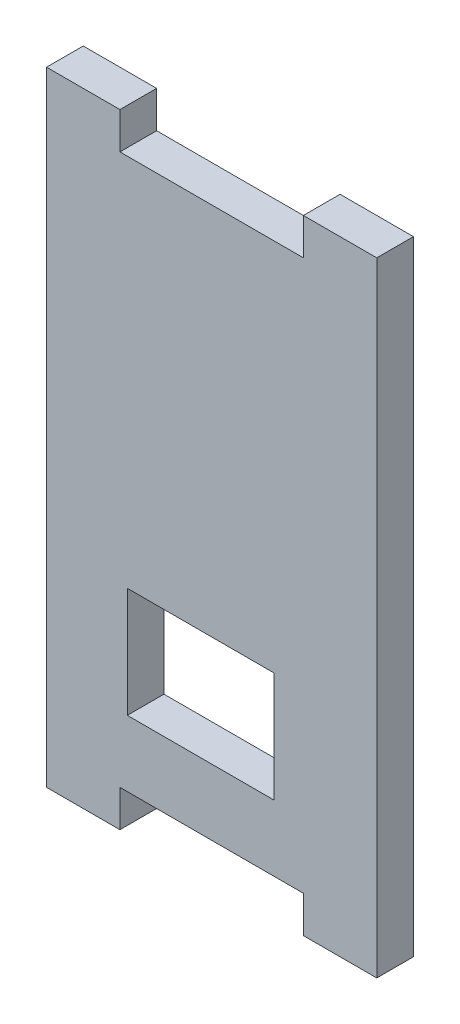
ISO-10303-21;
HEADER;
FILE_DESCRIPTION(('STEP AP214'),'2;1');
FILE_NAME('part.step','',(''),(''),'','','');
FILE_SCHEMA(('AUTOMOTIVE_DESIGN { 1 0 10303 214 1 1 1 1 }'));
ENDSEC;
DATA;
#1=APPLICATION_CONTEXT('core data for automotive mechanical design processes');
#2=APPLICATION_PROTOCOL_DEFINITION('international standard','automotive_design',2000,#1);
#3=PRODUCT_CONTEXT('',#1,'mechanical');
#4=PRODUCT('Part','Part','',(#3));
#5=PRODUCT_RELATED_PRODUCT_CATEGORY('part','',(#4));
#6=PRODUCT_DEFINITION_FORMATION('','',#4);
#7=PRODUCT_DEFINITION_CONTEXT('part definition',#1,'design');
#8=PRODUCT_DEFINITION('design','',#6,#7);
#9=PRODUCT_DEFINITION_SHAPE('','',#8);
#10=(LENGTH_UNIT() NAMED_UNIT(*) SI_UNIT(.MILLI.,.METRE.));
#11=(NAMED_UNIT(*) PLANE_ANGLE_UNIT() SI_UNIT($,.RADIAN.));
#12=(NAMED_UNIT(*) SI_UNIT($,.STERADIAN.) SOLID_ANGLE_UNIT());
#13=UNCERTAINTY_MEASURE_WITH_UNIT(LENGTH_MEASURE(1.E-05),#10,'distance_accuracy_value','');
#14=(GEOMETRIC_REPRESENTATION_CONTEXT(3) GLOBAL_UNCERTAINTY_ASSIGNED_CONTEXT((#13)) GLOBAL_UNIT_ASSIGNED_CONTEXT((#10,
#11,#12)) REPRESENTATION_CONTEXT('',''));
#15=CARTESIAN_POINT('',(0.,0.,0.));
#16=DIRECTION('',(0.,0.,1.));
#17=DIRECTION('',(1.,0.,0.));
#18=AXIS2_PLACEMENT_3D('',#15,#16,#17);
#19=CARTESIAN_POINT('',(0.,0.,5.));
#20=DIRECTION('',(0.,1.,0.));
#21=DIRECTION('',(0.,0.,1.));
#22=AXIS2_PLACEMENT_3D('',#19,#20,#21);
#23=PLANE('',#22);
#24=DIRECTION('',(1.,0.,0.));
#25=VECTOR('',#24,1.);
#26=CARTESIAN_POINT('',(0.,0.,0.));
#27=LINE('',#26,#25);
#28=CARTESIAN_POINT('',(9.99999999999999,0.,0.));
#29=VERTEX_POINT('',#28);
#30=CARTESIAN_POINT('',(35.,0.,0.));
#31=VERTEX_POINT('',#30);
#32=EDGE_CURVE('E164',#29,#31,#27,.T.);
#33=ORIENTED_EDGE('',*,*,#32,.T.);
#34=DIRECTION('',(0.,0.,1.));
#35=VECTOR('',#34,1.);
#36=CARTESIAN_POINT('',(35.,0.,0.));
#37=LINE('',#36,#35);
#38=CARTESIAN_POINT('',(35.,0.,5.));
#39=VERTEX_POINT('',#38);
#40=EDGE_CURVE('E149',#31,#39,#37,.T.);
#41=ORIENTED_EDGE('',*,*,#40,.T.);
#42=DIRECTION('',(1.,0.,0.));
#43=VECTOR('',#42,1.);
#44=CARTESIAN_POINT('',(0.,0.,5.));
#45=LINE('',#44,#43);
#46=CARTESIAN_POINT('',(10.,0.,5.));
#47=VERTEX_POINT('',#46);
#48=EDGE_CURVE('E180',#47,#39,#45,.T.);
#49=ORIENTED_EDGE('',*,*,#48,.F.);
#50=DIRECTION('',(0.,0.,1.));
#51=VECTOR('',#50,1.);
#52=CARTESIAN_POINT('',(10.,0.,0.));
#53=LINE('',#52,#51);
#54=EDGE_CURVE('E50',#29,#47,#53,.T.);
#55=ORIENTED_EDGE('',*,*,#54,.F.);
#56=EDGE_LOOP('',(#33,#41,#49,#55));
#57=FACE_BOUND('',#56,.T.);
#58=ADVANCED_FACE('F33',(#57),#23,.F.);
#59=CARTESIAN_POINT('',(0.,0.,5.));
#60=DIRECTION('',(0.,0.,-1.));
#61=DIRECTION('',(-1.,0.,0.));
#62=AXIS2_PLACEMENT_3D('',#59,#60,#61);
#63=PLANE('',#62);
#64=DIRECTION('',(0.,-1.,0.));
#65=VECTOR('',#64,1.);
#66=CARTESIAN_POINT('',(0.,0.,5.));
#67=LINE('',#66,#65);
#68=CARTESIAN_POINT('',(0.,80.,5.));
#69=VERTEX_POINT('',#68);
#70=CARTESIAN_POINT('',(0.,-5.00000000000002,5.));
#71=VERTEX_POINT('',#70);
#72=EDGE_CURVE('E190',#69,#71,#67,.T.);
#73=ORIENTED_EDGE('',*,*,#72,.T.);
#74=DIRECTION('',(1.,0.,0.));
#75=VECTOR('',#74,1.);
#76=CARTESIAN_POINT('',(0.,-5.00000000000002,5.));
#77=LINE('',#76,#75);
#78=CARTESIAN_POINT('',(10.,-5.00000000000002,5.));
#79=VERTEX_POINT('',#78);
#80=EDGE_CURVE('E263',#71,#79,#77,.T.);
#81=ORIENTED_EDGE('',*,*,#80,.T.);
#82=DIRECTION('',(0.,1.,0.));
#83=VECTOR('',#82,1.);
#84=CARTESIAN_POINT('',(10.,0.,5.));
#85=LINE('',#84,#83);
#86=EDGE_CURVE('E249',#79,#47,#85,.T.);
#87=ORIENTED_EDGE('',*,*,#86,.T.);
#88=ORIENTED_EDGE('',*,*,#48,.T.);
#89=DIRECTION('',(0.,-1.,0.));
#90=VECTOR('',#89,1.);
#91=CARTESIAN_POINT('',(35.,0.,5.));
#92=LINE('',#91,#90);
#93=CARTESIAN_POINT('',(35.,-5.,5.));
#94=VERTEX_POINT('',#93);
#95=EDGE_CURVE('E155',#39,#94,#92,.T.);
#96=ORIENTED_EDGE('',*,*,#95,.T.);
#97=DIRECTION('',(1.,0.,0.));
#98=VECTOR('',#97,1.);
#99=CARTESIAN_POINT('',(45.,-5.,5.));
#100=LINE('',#99,#98);
#101=CARTESIAN_POINT('',(45.,-5.,5.));
#102=VERTEX_POINT('',#101);
#103=EDGE_CURVE('E167',#94,#102,#100,.T.);
#104=ORIENTED_EDGE('',*,*,#103,.T.);
#105=DIRECTION('',(0.,1.,0.));
#106=VECTOR('',#105,1.);
#107=CARTESIAN_POINT('',(45.,0.,5.));
#108=LINE('',#107,#106);
#109=CARTESIAN_POINT('',(45.,80.,5.));
#110=VERTEX_POINT('',#109);
#111=EDGE_CURVE('E42',#102,#110,#108,.T.);
#112=ORIENTED_EDGE('',*,*,#111,.T.);
#113=DIRECTION('',(-1.,0.,0.));
#114=VECTOR('',#113,1.);
#115=CARTESIAN_POINT('',(45.,80.,5.));
#116=LINE('',#115,#114);
#117=CARTESIAN_POINT('',(35.,80.,5.));
#118=VERTEX_POINT('',#117);
#119=EDGE_CURVE('E253',#110,#118,#116,.T.);
#120=ORIENTED_EDGE('',*,*,#119,.T.);
#121=DIRECTION('',(0.,-1.,0.));
#122=VECTOR('',#121,1.);
#123=CARTESIAN_POINT('',(35.,75.,5.));
#124=LINE('',#123,#122);
#125=CARTESIAN_POINT('',(35.,75.,5.));
#126=VERTEX_POINT('',#125);
#127=EDGE_CURVE('E57',#118,#126,#124,.T.);
#128=ORIENTED_EDGE('',*,*,#127,.T.);
#129=DIRECTION('',(-1.,0.,0.));
#130=VECTOR('',#129,1.);
#131=CARTESIAN_POINT('',(0.,75.,5.));
#132=LINE('',#131,#130);
#133=CARTESIAN_POINT('',(9.99999999999999,75.,5.));
#134=VERTEX_POINT('',#133);
#135=EDGE_CURVE('E11',#126,#134,#132,.T.);
#136=ORIENTED_EDGE('',*,*,#135,.T.);
#137=DIRECTION('',(0.,1.,0.));
#138=VECTOR('',#137,1.);
#139=CARTESIAN_POINT('',(10.,75.,5.));
#140=LINE('',#139,#138);
#141=CARTESIAN_POINT('',(10.,80.,5.));
#142=VERTEX_POINT('',#141);
#143=EDGE_CURVE('E187',#134,#142,#140,.T.);
#144=ORIENTED_EDGE('',*,*,#143,.T.);
#145=DIRECTION('',(-1.,0.,0.));
#146=VECTOR('',#145,1.);
#147=CARTESIAN_POINT('',(0.,80.,5.));
#148=LINE('',#147,#146);
#149=EDGE_CURVE('E197',#142,#69,#148,.T.);
#150=ORIENTED_EDGE('',*,*,#149,.T.);
#151=EDGE_LOOP('',(#73,#81,#87,#88,#96,#104,#112,#120,#128,#136,#144,#150));
#152=FACE_BOUND('',#151,.T.);
#153=DIRECTION('',(0.,-1.,0.));
#154=VECTOR('',#153,1.);
#155=CARTESIAN_POINT('',(11.,24.,5.));
#156=LINE('',#155,#154);
#157=CARTESIAN_POINT('',(11.,24.,5.));
#158=VERTEX_POINT('',#157);
#159=CARTESIAN_POINT('',(11.,9.,5.));
#160=VERTEX_POINT('',#159);
#161=EDGE_CURVE('E207',#158,#160,#156,.T.);
#162=ORIENTED_EDGE('',*,*,#161,.F.);
#163=DIRECTION('',(-1.,0.,0.));
#164=VECTOR('',#163,1.);
#165=CARTESIAN_POINT('',(11.,24.,5.));
#166=LINE('',#165,#164);
#167=CARTESIAN_POINT('',(31.,24.,5.));
#168=VERTEX_POINT('',#167);
#169=EDGE_CURVE('E215',#168,#158,#166,.T.);
#170=ORIENTED_EDGE('',*,*,#169,.F.);
#171=DIRECTION('',(0.,1.,0.));
#172=VECTOR('',#171,1.);
#173=CARTESIAN_POINT('',(31.,24.,5.));
#174=LINE('',#173,#172);
#175=CARTESIAN_POINT('',(31.,9.,5.));
#176=VERTEX_POINT('',#175);
#177=EDGE_CURVE('E212',#176,#168,#174,.T.);
#178=ORIENTED_EDGE('',*,*,#177,.F.);
#179=DIRECTION('',(1.,0.,0.));
#180=VECTOR('',#179,1.);
#181=CARTESIAN_POINT('',(11.,9.,5.));
#182=LINE('',#181,#180);
#183=EDGE_CURVE('E209',#160,#176,#182,.T.);
#184=ORIENTED_EDGE('',*,*,#183,.F.);
#185=EDGE_LOOP('',(#162,#170,#178,#184));
#186=FACE_BOUND('',#185,.T.);
#187=ADVANCED_FACE('F244',(#152,#186),#63,.F.);
#188=CARTESIAN_POINT('',(0.,0.,0.));
#189=DIRECTION('',(0.,0.,-1.));
#190=DIRECTION('',(-1.,0.,0.));
#191=AXIS2_PLACEMENT_3D('',#188,#189,#190);
#192=PLANE('',#191);
#193=DIRECTION('',(0.,-1.,0.));
#194=VECTOR('',#193,1.);
#195=CARTESIAN_POINT('',(0.,0.,0.));
#196=LINE('',#195,#194);
#197=CARTESIAN_POINT('',(0.,80.,0.));
#198=VERTEX_POINT('',#197);
#199=CARTESIAN_POINT('',(0.,-5.00000000000002,0.));
#200=VERTEX_POINT('',#199);
#201=EDGE_CURVE('E170',#198,#200,#196,.T.);
#202=ORIENTED_EDGE('',*,*,#201,.F.);
#203=DIRECTION('',(-1.,0.,0.));
#204=VECTOR('',#203,1.);
#205=CARTESIAN_POINT('',(0.,80.,0.));
#206=LINE('',#205,#204);
#207=CARTESIAN_POINT('',(10.,80.,0.));
#208=VERTEX_POINT('',#207);
#209=EDGE_CURVE('E196',#208,#198,#206,.T.);
#210=ORIENTED_EDGE('',*,*,#209,.F.);
#211=DIRECTION('',(0.,1.,0.));
#212=VECTOR('',#211,1.);
#213=CARTESIAN_POINT('',(10.,75.,0.));
#214=LINE('',#213,#212);
#215=CARTESIAN_POINT('',(10.,75.,0.));
#216=VERTEX_POINT('',#215);
#217=EDGE_CURVE('E193',#216,#208,#214,.T.);
#218=ORIENTED_EDGE('',*,*,#217,.F.);
#219=DIRECTION('',(-1.,0.,0.));
#220=VECTOR('',#219,1.);
#221=CARTESIAN_POINT('',(0.,75.,0.));
#222=LINE('',#221,#220);
#223=CARTESIAN_POINT('',(35.,75.,0.));
#224=VERTEX_POINT('',#223);
#225=EDGE_CURVE('E172',#224,#216,#222,.T.);
#226=ORIENTED_EDGE('',*,*,#225,.F.);
#227=DIRECTION('',(0.,-1.,0.));
#228=VECTOR('',#227,1.);
#229=CARTESIAN_POINT('',(35.,75.,0.));
#230=LINE('',#229,#228);
#231=CARTESIAN_POINT('',(35.,80.,0.));
#232=VERTEX_POINT('',#231);
#233=EDGE_CURVE('E271',#232,#224,#230,.T.);
#234=ORIENTED_EDGE('',*,*,#233,.F.);
#235=DIRECTION('',(-1.,0.,0.));
#236=VECTOR('',#235,1.);
#237=CARTESIAN_POINT('',(45.,80.,0.));
#238=LINE('',#237,#236);
#239=CARTESIAN_POINT('',(45.,80.,0.));
#240=VERTEX_POINT('',#239);
#241=EDGE_CURVE('E268',#240,#232,#238,.T.);
#242=ORIENTED_EDGE('',*,*,#241,.F.);
#243=DIRECTION('',(0.,1.,0.));
#244=VECTOR('',#243,1.);
#245=CARTESIAN_POINT('',(45.,0.,0.));
#246=LINE('',#245,#244);
#247=CARTESIAN_POINT('',(45.,-5.,0.));
#248=VERTEX_POINT('',#247);
#249=EDGE_CURVE('E169',#248,#240,#246,.T.);
#250=ORIENTED_EDGE('',*,*,#249,.F.);
#251=DIRECTION('',(1.,0.,0.));
#252=VECTOR('',#251,1.);
#253=CARTESIAN_POINT('',(45.,-5.,0.));
#254=LINE('',#253,#252);
#255=CARTESIAN_POINT('',(35.,-5.,0.));
#256=VERTEX_POINT('',#255);
#257=EDGE_CURVE('E158',#256,#248,#254,.T.);
#258=ORIENTED_EDGE('',*,*,#257,.F.);
#259=DIRECTION('',(0.,-1.,0.));
#260=VECTOR('',#259,1.);
#261=CARTESIAN_POINT('',(35.,0.,0.));
#262=LINE('',#261,#260);
#263=EDGE_CURVE('E152',#31,#256,#262,.T.);
#264=ORIENTED_EDGE('',*,*,#263,.F.);
#265=ORIENTED_EDGE('',*,*,#32,.F.);
#266=DIRECTION('',(0.,1.,0.));
#267=VECTOR('',#266,1.);
#268=CARTESIAN_POINT('',(10.,0.,0.));
#269=LINE('',#268,#267);
#270=CARTESIAN_POINT('',(10.,-5.00000000000002,0.));
#271=VERTEX_POINT('',#270);
#272=EDGE_CURVE('E252',#271,#29,#269,.T.);
#273=ORIENTED_EDGE('',*,*,#272,.F.);
#274=DIRECTION('',(1.,0.,0.));
#275=VECTOR('',#274,1.);
#276=CARTESIAN_POINT('',(0.,-5.00000000000002,0.));
#277=LINE('',#276,#275);
#278=EDGE_CURVE('E472',#200,#271,#277,.T.);
#279=ORIENTED_EDGE('',*,*,#278,.F.);
#280=EDGE_LOOP('',(#202,#210,#218,#226,#234,#242,#250,#258,#264,#265,#273,#279));
#281=FACE_BOUND('',#280,.T.);
#282=DIRECTION('',(-1.,0.,0.));
#283=VECTOR('',#282,1.);
#284=CARTESIAN_POINT('',(11.,24.,0.));
#285=LINE('',#284,#283);
#286=CARTESIAN_POINT('',(31.,24.,0.));
#287=VERTEX_POINT('',#286);
#288=CARTESIAN_POINT('',(11.,24.,0.));
#289=VERTEX_POINT('',#288);
#290=EDGE_CURVE('E210',#287,#289,#285,.T.);
#291=ORIENTED_EDGE('',*,*,#290,.T.);
#292=DIRECTION('',(0.,-1.,0.));
#293=VECTOR('',#292,1.);
#294=CARTESIAN_POINT('',(11.,24.,0.));
#295=LINE('',#294,#293);
#296=CARTESIAN_POINT('',(11.,9.,0.));
#297=VERTEX_POINT('',#296);
#298=EDGE_CURVE('E218',#289,#297,#295,.T.);
#299=ORIENTED_EDGE('',*,*,#298,.T.);
#300=DIRECTION('',(1.,0.,0.));
#301=VECTOR('',#300,1.);
#302=CARTESIAN_POINT('',(11.,9.,0.));
#303=LINE('',#302,#301);
#304=CARTESIAN_POINT('',(31.,9.,0.));
#305=VERTEX_POINT('',#304);
#306=EDGE_CURVE('E221',#297,#305,#303,.T.);
#307=ORIENTED_EDGE('',*,*,#306,.T.);
#308=DIRECTION('',(0.,1.,0.));
#309=VECTOR('',#308,1.);
#310=CARTESIAN_POINT('',(31.,24.,0.));
#311=LINE('',#310,#309);
#312=EDGE_CURVE('E225',#305,#287,#311,.T.);
#313=ORIENTED_EDGE('',*,*,#312,.T.);
#314=EDGE_LOOP('',(#291,#299,#307,#313));
#315=FACE_BOUND('',#314,.T.);
#316=ADVANCED_FACE('F161',(#281,#315),#192,.T.);
#317=CARTESIAN_POINT('',(0.,0.,5.));
#318=DIRECTION('',(1.,0.,0.));
#319=DIRECTION('',(0.,0.,-1.));
#320=AXIS2_PLACEMENT_3D('',#317,#318,#319);
#321=PLANE('',#320);
#322=ORIENTED_EDGE('',*,*,#201,.T.);
#323=DIRECTION('',(0.,0.,1.));
#324=VECTOR('',#323,1.);
#325=CARTESIAN_POINT('',(0.,-5.00000000000002,0.));
#326=LINE('',#325,#324);
#327=EDGE_CURVE('E256',#200,#71,#326,.T.);
#328=ORIENTED_EDGE('',*,*,#327,.T.);
#329=ORIENTED_EDGE('',*,*,#72,.F.);
#330=DIRECTION('',(0.,0.,1.));
#331=VECTOR('',#330,1.);
#332=CARTESIAN_POINT('',(0.,80.,0.));
#333=LINE('',#332,#331);
#334=EDGE_CURVE('E222',#198,#69,#333,.T.);
#335=ORIENTED_EDGE('',*,*,#334,.F.);
#336=EDGE_LOOP('',(#322,#328,#329,#335));
#337=FACE_BOUND('',#336,.T.);
#338=ADVANCED_FACE('F35',(#337),#321,.F.);
#339=CARTESIAN_POINT('',(45.,0.,5.));
#340=DIRECTION('',(-1.,0.,0.));
#341=DIRECTION('',(0.,0.,1.));
#342=AXIS2_PLACEMENT_3D('',#339,#340,#341);
#343=PLANE('',#342);
#344=ORIENTED_EDGE('',*,*,#249,.T.);
#345=DIRECTION('',(0.,0.,1.));
#346=VECTOR('',#345,1.);
#347=CARTESIAN_POINT('',(45.,80.,0.));
#348=LINE('',#347,#346);
#349=EDGE_CURVE('E272',#240,#110,#348,.T.);
#350=ORIENTED_EDGE('',*,*,#349,.T.);
#351=ORIENTED_EDGE('',*,*,#111,.F.);
#352=DIRECTION('',(0.,0.,1.));
#353=VECTOR('',#352,1.);
#354=CARTESIAN_POINT('',(45.,-5.,0.));
#355=LINE('',#354,#353);
#356=EDGE_CURVE('E466',#248,#102,#355,.T.);
#357=ORIENTED_EDGE('',*,*,#356,.F.);
#358=EDGE_LOOP('',(#344,#350,#351,#357));
#359=FACE_BOUND('',#358,.T.);
#360=ADVANCED_FACE('F315',(#359),#343,.F.);
#361=CARTESIAN_POINT('',(0.,75.,5.));
#362=DIRECTION('',(0.,-1.,0.));
#363=DIRECTION('',(0.,0.,-1.));
#364=AXIS2_PLACEMENT_3D('',#361,#362,#363);
#365=PLANE('',#364);
#366=ORIENTED_EDGE('',*,*,#135,.F.);
#367=DIRECTION('',(0.,0.,1.));
#368=VECTOR('',#367,1.);
#369=CARTESIAN_POINT('',(35.,75.,0.));
#370=LINE('',#369,#368);
#371=EDGE_CURVE('E275',#224,#126,#370,.T.);
#372=ORIENTED_EDGE('',*,*,#371,.F.);
#373=ORIENTED_EDGE('',*,*,#225,.T.);
#374=DIRECTION('',(0.,0.,1.));
#375=VECTOR('',#374,1.);
#376=CARTESIAN_POINT('',(10.,75.,0.));
#377=LINE('',#376,#375);
#378=EDGE_CURVE('E198',#216,#134,#377,.T.);
#379=ORIENTED_EDGE('',*,*,#378,.T.);
#380=EDGE_LOOP('',(#366,#372,#373,#379));
#381=FACE_BOUND('',#380,.T.);
#382=ADVANCED_FACE('F318',(#381),#365,.F.);
#383=CARTESIAN_POINT('',(11.,24.,5.));
#384=DIRECTION('',(1.,0.,0.));
#385=DIRECTION('',(0.,1.,0.));
#386=AXIS2_PLACEMENT_3D('',#383,#384,#385);
#387=PLANE('',#386);
#388=ORIENTED_EDGE('',*,*,#298,.F.);
#389=DIRECTION('',(0.,0.,-1.));
#390=VECTOR('',#389,1.);
#391=CARTESIAN_POINT('',(11.,24.,5.));
#392=LINE('',#391,#390);
#393=EDGE_CURVE('E217',#158,#289,#392,.T.);
#394=ORIENTED_EDGE('',*,*,#393,.F.);
#395=ORIENTED_EDGE('',*,*,#161,.T.);
#396=DIRECTION('',(0.,0.,-1.));
#397=VECTOR('',#396,1.);
#398=CARTESIAN_POINT('',(11.,9.,5.));
#399=LINE('',#398,#397);
#400=EDGE_CURVE('E174',#160,#297,#399,.T.);
#401=ORIENTED_EDGE('',*,*,#400,.T.);
#402=EDGE_LOOP('',(#388,#394,#395,#401));
#403=FACE_BOUND('',#402,.T.);
#404=ADVANCED_FACE('F322',(#403),#387,.T.);
#405=CARTESIAN_POINT('',(11.,9.,5.));
#406=DIRECTION('',(0.,1.,0.));
#407=DIRECTION('',(0.,0.,1.));
#408=AXIS2_PLACEMENT_3D('',#405,#406,#407);
#409=PLANE('',#408);
#410=ORIENTED_EDGE('',*,*,#306,.F.);
#411=ORIENTED_EDGE('',*,*,#400,.F.);
#412=ORIENTED_EDGE('',*,*,#183,.T.);
#413=DIRECTION('',(0.,0.,-1.));
#414=VECTOR('',#413,1.);
#415=CARTESIAN_POINT('',(31.,9.,5.));
#416=LINE('',#415,#414);
#417=EDGE_CURVE('E234',#176,#305,#416,.T.);
#418=ORIENTED_EDGE('',*,*,#417,.T.);
#419=EDGE_LOOP('',(#410,#411,#412,#418));
#420=FACE_BOUND('',#419,.T.);
#421=ADVANCED_FACE('F328',(#420),#409,.T.);
#422=CARTESIAN_POINT('',(31.,24.,5.));
#423=DIRECTION('',(-1.,0.,0.));
#424=DIRECTION('',(0.,-1.,0.));
#425=AXIS2_PLACEMENT_3D('',#422,#423,#424);
#426=PLANE('',#425);
#427=ORIENTED_EDGE('',*,*,#312,.F.);
#428=ORIENTED_EDGE('',*,*,#417,.F.);
#429=ORIENTED_EDGE('',*,*,#177,.T.);
#430=DIRECTION('',(0.,0.,-1.));
#431=VECTOR('',#430,1.);
#432=CARTESIAN_POINT('',(31.,24.,5.));
#433=LINE('',#432,#431);
#434=EDGE_CURVE('E232',#168,#287,#433,.T.);
#435=ORIENTED_EDGE('',*,*,#434,.T.);
#436=EDGE_LOOP('',(#427,#428,#429,#435));
#437=FACE_BOUND('',#436,.T.);
#438=ADVANCED_FACE('F305',(#437),#426,.T.);
#439=CARTESIAN_POINT('',(11.,24.,5.));
#440=DIRECTION('',(0.,-1.,0.));
#441=DIRECTION('',(1.,0.,0.));
#442=AXIS2_PLACEMENT_3D('',#439,#440,#441);
#443=PLANE('',#442);
#444=ORIENTED_EDGE('',*,*,#290,.F.);
#445=ORIENTED_EDGE('',*,*,#434,.F.);
#446=ORIENTED_EDGE('',*,*,#169,.T.);
#447=ORIENTED_EDGE('',*,*,#393,.T.);
#448=EDGE_LOOP('',(#444,#445,#446,#447));
#449=FACE_BOUND('',#448,.T.);
#450=ADVANCED_FACE('F297',(#449),#443,.T.);
#451=CARTESIAN_POINT('',(0.,80.,0.));
#452=DIRECTION('',(0.,1.,0.));
#453=DIRECTION('',(0.,0.,1.));
#454=AXIS2_PLACEMENT_3D('',#451,#452,#453);
#455=PLANE('',#454);
#456=ORIENTED_EDGE('',*,*,#149,.F.);
#457=DIRECTION('',(0.,0.,1.));
#458=VECTOR('',#457,1.);
#459=CARTESIAN_POINT('',(10.,80.,0.));
#460=LINE('',#459,#458);
#461=EDGE_CURVE('E201',#208,#142,#460,.T.);
#462=ORIENTED_EDGE('',*,*,#461,.F.);
#463=ORIENTED_EDGE('',*,*,#209,.T.);
#464=ORIENTED_EDGE('',*,*,#334,.T.);
#465=EDGE_LOOP('',(#456,#462,#463,#464));
#466=FACE_BOUND('',#465,.T.);
#467=ADVANCED_FACE('F295',(#466),#455,.T.);
#468=CARTESIAN_POINT('',(10.,75.,0.));
#469=DIRECTION('',(1.,0.,0.));
#470=DIRECTION('',(0.,0.,-1.));
#471=AXIS2_PLACEMENT_3D('',#468,#469,#470);
#472=PLANE('',#471);
#473=ORIENTED_EDGE('',*,*,#143,.F.);
#474=ORIENTED_EDGE('',*,*,#378,.F.);
#475=ORIENTED_EDGE('',*,*,#217,.T.);
#476=ORIENTED_EDGE('',*,*,#461,.T.);
#477=EDGE_LOOP('',(#473,#474,#475,#476));
#478=FACE_BOUND('',#477,.T.);
#479=ADVANCED_FACE('F290',(#478),#472,.T.);
#480=CARTESIAN_POINT('',(35.,75.,0.));
#481=DIRECTION('',(-1.,0.,0.));
#482=DIRECTION('',(0.,0.,1.));
#483=AXIS2_PLACEMENT_3D('',#480,#481,#482);
#484=PLANE('',#483);
#485=ORIENTED_EDGE('',*,*,#127,.F.);
#486=DIRECTION('',(0.,0.,1.));
#487=VECTOR('',#486,1.);
#488=CARTESIAN_POINT('',(35.,80.,0.));
#489=LINE('',#488,#487);
#490=EDGE_CURVE('E277',#232,#118,#489,.T.);
#491=ORIENTED_EDGE('',*,*,#490,.F.);
#492=ORIENTED_EDGE('',*,*,#233,.T.);
#493=ORIENTED_EDGE('',*,*,#371,.T.);
#494=EDGE_LOOP('',(#485,#491,#492,#493));
#495=FACE_BOUND('',#494,.T.);
#496=ADVANCED_FACE('F303',(#495),#484,.T.);
#497=CARTESIAN_POINT('',(45.,80.,0.));
#498=DIRECTION('',(0.,1.,0.));
#499=DIRECTION('',(0.,0.,1.));
#500=AXIS2_PLACEMENT_3D('',#497,#498,#499);
#501=PLANE('',#500);
#502=ORIENTED_EDGE('',*,*,#119,.F.);
#503=ORIENTED_EDGE('',*,*,#349,.F.);
#504=ORIENTED_EDGE('',*,*,#241,.T.);
#505=ORIENTED_EDGE('',*,*,#490,.T.);
#506=EDGE_LOOP('',(#502,#503,#504,#505));
#507=FACE_BOUND('',#506,.T.);
#508=ADVANCED_FACE('F415',(#507),#501,.T.);
#509=CARTESIAN_POINT('',(10.,0.,0.));
#510=DIRECTION('',(1.,0.,0.));
#511=DIRECTION('',(0.,0.,-1.));
#512=AXIS2_PLACEMENT_3D('',#509,#510,#511);
#513=PLANE('',#512);
#514=ORIENTED_EDGE('',*,*,#86,.F.);
#515=DIRECTION('',(0.,0.,1.));
#516=VECTOR('',#515,1.);
#517=CARTESIAN_POINT('',(10.,-5.00000000000002,0.));
#518=LINE('',#517,#516);
#519=EDGE_CURVE('E254',#271,#79,#518,.T.);
#520=ORIENTED_EDGE('',*,*,#519,.F.);
#521=ORIENTED_EDGE('',*,*,#272,.T.);
#522=ORIENTED_EDGE('',*,*,#54,.T.);
#523=EDGE_LOOP('',(#514,#520,#521,#522));
#524=FACE_BOUND('',#523,.T.);
#525=ADVANCED_FACE('F251',(#524),#513,.T.);
#526=CARTESIAN_POINT('',(0.,-5.00000000000002,0.));
#527=DIRECTION('',(0.,-1.,0.));
#528=DIRECTION('',(0.,0.,-1.));
#529=AXIS2_PLACEMENT_3D('',#526,#527,#528);
#530=PLANE('',#529);
#531=ORIENTED_EDGE('',*,*,#80,.F.);
#532=ORIENTED_EDGE('',*,*,#327,.F.);
#533=ORIENTED_EDGE('',*,*,#278,.T.);
#534=ORIENTED_EDGE('',*,*,#519,.T.);
#535=EDGE_LOOP('',(#531,#532,#533,#534));
#536=FACE_BOUND('',#535,.T.);
#537=ADVANCED_FACE('F433',(#536),#530,.T.);
#538=CARTESIAN_POINT('',(45.,-5.,0.));
#539=DIRECTION('',(0.,-1.,0.));
#540=DIRECTION('',(1.,0.,0.));
#541=AXIS2_PLACEMENT_3D('',#538,#539,#540);
#542=PLANE('',#541);
#543=ORIENTED_EDGE('',*,*,#103,.F.);
#544=DIRECTION('',(0.,0.,1.));
#545=VECTOR('',#544,1.);
#546=CARTESIAN_POINT('',(35.,-5.,0.));
#547=LINE('',#546,#545);
#548=EDGE_CURVE('E157',#256,#94,#547,.T.);
#549=ORIENTED_EDGE('',*,*,#548,.F.);
#550=ORIENTED_EDGE('',*,*,#257,.T.);
#551=ORIENTED_EDGE('',*,*,#356,.T.);
#552=EDGE_LOOP('',(#543,#549,#550,#551));
#553=FACE_BOUND('',#552,.T.);
#554=ADVANCED_FACE('F442',(#553),#542,.T.);
#555=CARTESIAN_POINT('',(35.,0.,0.));
#556=DIRECTION('',(-1.,0.,0.));
#557=DIRECTION('',(0.,0.,1.));
#558=AXIS2_PLACEMENT_3D('',#555,#556,#557);
#559=PLANE('',#558);
#560=ORIENTED_EDGE('',*,*,#95,.F.);
#561=ORIENTED_EDGE('',*,*,#40,.F.);
#562=ORIENTED_EDGE('',*,*,#263,.T.);
#563=ORIENTED_EDGE('',*,*,#548,.T.);
#564=EDGE_LOOP('',(#560,#561,#562,#563));
#565=FACE_BOUND('',#564,.T.);
#566=ADVANCED_FACE('F151',(#565),#559,.T.);
#567=CLOSED_SHELL('',(#58,#187,#316,#338,#360,#382,#404,#421,#438,#450,#467,#479,#496,#508,#525,
#537,#554,#566));
#568=MANIFOLD_SOLID_BREP('B2',#567);
#569=ADVANCED_BREP_SHAPE_REPRESENTATION('',(#18,#568),#14);
#570=SHAPE_DEFINITION_REPRESENTATION(#9,#569);
ENDSEC;
END-ISO-10303-21;
